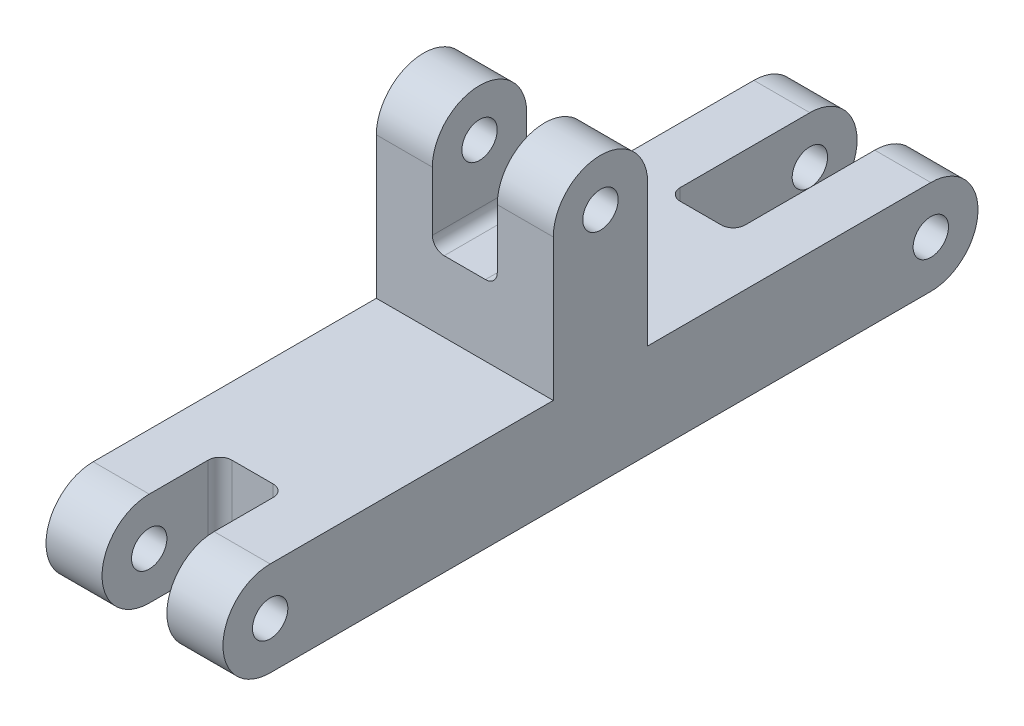
ISO-10303-21;
HEADER;
FILE_DESCRIPTION(('STEP AP214'),'2;1');
FILE_NAME('part.step','',(''),(''),'','','');
FILE_SCHEMA(('AUTOMOTIVE_DESIGN { 1 0 10303 214 1 1 1 1 }'));
ENDSEC;
DATA;
#1=APPLICATION_CONTEXT('core data for automotive mechanical design processes');
#2=APPLICATION_PROTOCOL_DEFINITION('international standard','automotive_design',2000,#1);
#3=PRODUCT_CONTEXT('',#1,'mechanical');
#4=PRODUCT('Part','Part','',(#3));
#5=PRODUCT_RELATED_PRODUCT_CATEGORY('part','',(#4));
#6=PRODUCT_DEFINITION_FORMATION('','',#4);
#7=PRODUCT_DEFINITION_CONTEXT('part definition',#1,'design');
#8=PRODUCT_DEFINITION('design','',#6,#7);
#9=PRODUCT_DEFINITION_SHAPE('','',#8);
#10=(LENGTH_UNIT() NAMED_UNIT(*) SI_UNIT(.MILLI.,.METRE.));
#11=(NAMED_UNIT(*) PLANE_ANGLE_UNIT() SI_UNIT($,.RADIAN.));
#12=(NAMED_UNIT(*) SI_UNIT($,.STERADIAN.) SOLID_ANGLE_UNIT());
#13=UNCERTAINTY_MEASURE_WITH_UNIT(LENGTH_MEASURE(1.E-05),#10,'distance_accuracy_value','');
#14=(GEOMETRIC_REPRESENTATION_CONTEXT(3) GLOBAL_UNCERTAINTY_ASSIGNED_CONTEXT((#13)) GLOBAL_UNIT_ASSIGNED_CONTEXT((#10,
#11,#12)) REPRESENTATION_CONTEXT('',''));
#15=CARTESIAN_POINT('',(0.,0.,0.));
#16=DIRECTION('',(0.,0.,1.));
#17=DIRECTION('',(1.,0.,0.));
#18=AXIS2_PLACEMENT_3D('',#15,#16,#17);
#19=CARTESIAN_POINT('',(7.5,0.,41.));
#20=DIRECTION('',(-1.,0.,0.));
#21=DIRECTION('',(0.,0.,1.));
#22=AXIS2_PLACEMENT_3D('',#19,#20,#21);
#23=CYLINDRICAL_SURFACE('',#22,3.99999999999999);
#24=CARTESIAN_POINT('',(2.75,0.,41.));
#25=DIRECTION('',(-1.,0.,0.));
#26=DIRECTION('',(0.,0.,1.));
#27=AXIS2_PLACEMENT_3D('',#24,#25,#26);
#28=CIRCLE('',#27,3.99999999999999);
#29=CARTESIAN_POINT('',(2.75,-3.99999999999999,41.));
#30=VERTEX_POINT('',#29);
#31=CARTESIAN_POINT('',(2.75,3.99999999999999,41.));
#32=VERTEX_POINT('',#31);
#33=EDGE_CURVE('E222',#30,#32,#28,.T.);
#34=ORIENTED_EDGE('',*,*,#33,.F.);
#35=DIRECTION('',(-1.,0.,0.));
#36=VECTOR('',#35,1.);
#37=CARTESIAN_POINT('',(7.5,-3.99999999999999,41.));
#38=LINE('',#37,#36);
#39=CARTESIAN_POINT('',(7.5,-3.99999999999999,41.));
#40=VERTEX_POINT('',#39);
#41=EDGE_CURVE('E238',#40,#30,#38,.T.);
#42=ORIENTED_EDGE('',*,*,#41,.F.);
#43=CARTESIAN_POINT('',(7.5,0.,41.));
#44=DIRECTION('',(1.,0.,0.));
#45=DIRECTION('',(0.,0.,-1.));
#46=AXIS2_PLACEMENT_3D('',#43,#44,#45);
#47=CIRCLE('',#46,3.99999999999999);
#48=CARTESIAN_POINT('',(7.5,3.99999999999999,41.));
#49=VERTEX_POINT('',#48);
#50=EDGE_CURVE('E231',#49,#40,#47,.T.);
#51=ORIENTED_EDGE('',*,*,#50,.F.);
#52=DIRECTION('',(-1.,0.,0.));
#53=VECTOR('',#52,1.);
#54=CARTESIAN_POINT('',(7.5,3.99999999999999,41.));
#55=LINE('',#54,#53);
#56=EDGE_CURVE('E213',#49,#32,#55,.T.);
#57=ORIENTED_EDGE('',*,*,#56,.T.);
#58=EDGE_LOOP('',(#34,#42,#51,#57));
#59=FACE_BOUND('',#58,.T.);
#60=ADVANCED_FACE('F34',(#59),#23,.T.);
#61=CARTESIAN_POINT('',(7.5,-4.,15.));
#62=DIRECTION('',(0.,1.,0.));
#63=DIRECTION('',(0.,0.,1.));
#64=AXIS2_PLACEMENT_3D('',#61,#62,#63);
#65=PLANE('',#64);
#66=DIRECTION('',(1.,0.,0.));
#67=VECTOR('',#66,1.);
#68=CARTESIAN_POINT('',(-2.75,-3.99999999999999,35.));
#69=LINE('',#68,#67);
#70=CARTESIAN_POINT('',(-1.75,-3.99999999999999,35.));
#71=VERTEX_POINT('',#70);
#72=CARTESIAN_POINT('',(1.75,-3.99999999999999,35.));
#73=VERTEX_POINT('',#72);
#74=EDGE_CURVE('E316',#71,#73,#69,.T.);
#75=ORIENTED_EDGE('',*,*,#74,.F.);
#76=CARTESIAN_POINT('',(-1.75,-4.,36.));
#77=DIRECTION('',(0.,1.,0.));
#78=DIRECTION('',(0.,0.,1.));
#79=AXIS2_PLACEMENT_3D('',#76,#77,#78);
#80=CIRCLE('',#79,1.);
#81=CARTESIAN_POINT('',(-2.75,-3.99999999999999,36.));
#82=VERTEX_POINT('',#81);
#83=EDGE_CURVE('E11',#71,#82,#80,.T.);
#84=ORIENTED_EDGE('',*,*,#83,.T.);
#85=DIRECTION('',(0.,0.,-1.));
#86=VECTOR('',#85,1.);
#87=CARTESIAN_POINT('',(-2.75,-3.99999999999999,35.));
#88=LINE('',#87,#86);
#89=CARTESIAN_POINT('',(-2.75,-3.99999999999999,41.));
#90=VERTEX_POINT('',#89);
#91=EDGE_CURVE('E317',#90,#82,#88,.T.);
#92=ORIENTED_EDGE('',*,*,#91,.F.);
#93=CARTESIAN_POINT('',(-7.5,-3.99999999999999,41.));
#94=VERTEX_POINT('',#93);
#95=EDGE_CURVE('E427',#90,#94,#38,.T.);
#96=ORIENTED_EDGE('',*,*,#95,.T.);
#97=DIRECTION('',(0.,0.,-1.));
#98=VECTOR('',#97,1.);
#99=CARTESIAN_POINT('',(-7.5,-4.,15.));
#100=LINE('',#99,#98);
#101=CARTESIAN_POINT('',(-7.5,-4.,-15.));
#102=VERTEX_POINT('',#101);
#103=EDGE_CURVE('E393',#94,#102,#100,.T.);
#104=ORIENTED_EDGE('',*,*,#103,.T.);
#105=DIRECTION('',(-1.,0.,0.));
#106=VECTOR('',#105,1.);
#107=CARTESIAN_POINT('',(7.5,-4.,-15.));
#108=LINE('',#107,#106);
#109=CARTESIAN_POINT('',(-2.75,-3.99999999999999,-15.));
#110=VERTEX_POINT('',#109);
#111=EDGE_CURVE('E424',#110,#102,#108,.T.);
#112=ORIENTED_EDGE('',*,*,#111,.F.);
#113=DIRECTION('',(0.,0.,-1.));
#114=VECTOR('',#113,1.);
#115=CARTESIAN_POINT('',(-2.75,-3.99999999999999,-3.));
#116=LINE('',#115,#114);
#117=CARTESIAN_POINT('',(-2.75,-3.99999999999999,-4.));
#118=VERTEX_POINT('',#117);
#119=EDGE_CURVE('E330',#118,#110,#116,.T.);
#120=ORIENTED_EDGE('',*,*,#119,.F.);
#121=CARTESIAN_POINT('',(-1.75,-4.,-4.));
#122=DIRECTION('',(0.,1.,0.));
#123=DIRECTION('',(0.,0.,1.));
#124=AXIS2_PLACEMENT_3D('',#121,#122,#123);
#125=CIRCLE('',#124,1.);
#126=CARTESIAN_POINT('',(-1.75,-3.99999999999999,-3.));
#127=VERTEX_POINT('',#126);
#128=EDGE_CURVE('E302',#118,#127,#125,.T.);
#129=ORIENTED_EDGE('',*,*,#128,.T.);
#130=DIRECTION('',(1.,0.,0.));
#131=VECTOR('',#130,1.);
#132=CARTESIAN_POINT('',(-2.75,-3.99999999999999,-3.));
#133=LINE('',#132,#131);
#134=CARTESIAN_POINT('',(1.75,-3.99999999999999,-3.));
#135=VERTEX_POINT('',#134);
#136=EDGE_CURVE('E336',#127,#135,#133,.T.);
#137=ORIENTED_EDGE('',*,*,#136,.T.);
#138=CARTESIAN_POINT('',(1.75,-4.,-4.));
#139=DIRECTION('',(0.,1.,0.));
#140=DIRECTION('',(0.,0.,1.));
#141=AXIS2_PLACEMENT_3D('',#138,#139,#140);
#142=CIRCLE('',#141,1.);
#143=CARTESIAN_POINT('',(2.75,-3.99999999999999,-4.));
#144=VERTEX_POINT('',#143);
#145=EDGE_CURVE('E298',#135,#144,#142,.T.);
#146=ORIENTED_EDGE('',*,*,#145,.T.);
#147=DIRECTION('',(0.,0.,-1.));
#148=VECTOR('',#147,1.);
#149=CARTESIAN_POINT('',(2.75,-3.99999999999999,-3.));
#150=LINE('',#149,#148);
#151=CARTESIAN_POINT('',(2.75,-3.99999999999999,-15.));
#152=VERTEX_POINT('',#151);
#153=EDGE_CURVE('E337',#144,#152,#150,.T.);
#154=ORIENTED_EDGE('',*,*,#153,.T.);
#155=CARTESIAN_POINT('',(7.5,-4.,-15.));
#156=VERTEX_POINT('',#155);
#157=EDGE_CURVE('E425',#156,#152,#108,.T.);
#158=ORIENTED_EDGE('',*,*,#157,.F.);
#159=DIRECTION('',(0.,0.,-1.));
#160=VECTOR('',#159,1.);
#161=CARTESIAN_POINT('',(7.5,-4.,15.));
#162=LINE('',#161,#160);
#163=EDGE_CURVE('E375',#40,#156,#162,.T.);
#164=ORIENTED_EDGE('',*,*,#163,.F.);
#165=ORIENTED_EDGE('',*,*,#41,.T.);
#166=DIRECTION('',(0.,0.,-1.));
#167=VECTOR('',#166,1.);
#168=CARTESIAN_POINT('',(2.75,-3.99999999999999,35.));
#169=LINE('',#168,#167);
#170=CARTESIAN_POINT('',(2.75,-3.99999999999999,36.));
#171=VERTEX_POINT('',#170);
#172=EDGE_CURVE('E218',#30,#171,#169,.T.);
#173=ORIENTED_EDGE('',*,*,#172,.T.);
#174=CARTESIAN_POINT('',(1.75,-4.,36.));
#175=DIRECTION('',(0.,1.,0.));
#176=DIRECTION('',(0.,0.,1.));
#177=AXIS2_PLACEMENT_3D('',#174,#175,#176);
#178=CIRCLE('',#177,1.);
#179=EDGE_CURVE('E307',#171,#73,#178,.T.);
#180=ORIENTED_EDGE('',*,*,#179,.T.);
#181=EDGE_LOOP('',(#75,#84,#92,#96,#104,#112,#120,#129,#137,#146,#154,#158,#164,#165,#173,#180));
#182=FACE_BOUND('',#181,.T.);
#183=ADVANCED_FACE('F440',(#182),#65,.F.);
#184=CARTESIAN_POINT('',(7.5,0.,-15.));
#185=DIRECTION('',(-1.,0.,0.));
#186=DIRECTION('',(0.,0.,1.));
#187=AXIS2_PLACEMENT_3D('',#184,#185,#186);
#188=CYLINDRICAL_SURFACE('',#187,4.);
#189=CARTESIAN_POINT('',(-2.75,0.,-15.));
#190=DIRECTION('',(1.,0.,0.));
#191=DIRECTION('',(0.,0.,-1.));
#192=AXIS2_PLACEMENT_3D('',#189,#190,#191);
#193=CIRCLE('',#192,4.);
#194=CARTESIAN_POINT('',(-2.75,4.,-15.));
#195=VERTEX_POINT('',#194);
#196=EDGE_CURVE('E262',#110,#195,#193,.T.);
#197=ORIENTED_EDGE('',*,*,#196,.F.);
#198=ORIENTED_EDGE('',*,*,#111,.T.);
#199=CARTESIAN_POINT('',(-7.5,0.,-15.));
#200=DIRECTION('',(1.,0.,0.));
#201=DIRECTION('',(0.,0.,-1.));
#202=AXIS2_PLACEMENT_3D('',#199,#200,#201);
#203=CIRCLE('',#202,4.);
#204=CARTESIAN_POINT('',(-7.5,4.,-15.));
#205=VERTEX_POINT('',#204);
#206=EDGE_CURVE('E396',#102,#205,#203,.T.);
#207=ORIENTED_EDGE('',*,*,#206,.T.);
#208=DIRECTION('',(-1.,0.,0.));
#209=VECTOR('',#208,1.);
#210=CARTESIAN_POINT('',(7.5,4.,-15.));
#211=LINE('',#210,#209);
#212=EDGE_CURVE('E421',#195,#205,#211,.T.);
#213=ORIENTED_EDGE('',*,*,#212,.F.);
#214=EDGE_LOOP('',(#197,#198,#207,#213));
#215=FACE_BOUND('',#214,.T.);
#216=ADVANCED_FACE('F434',(#215),#188,.T.);
#217=CARTESIAN_POINT('',(7.5,3.99999999999999,9.00000000000001));
#218=DIRECTION('',(0.,-1.,0.));
#219=DIRECTION('',(0.,0.,-1.));
#220=AXIS2_PLACEMENT_3D('',#217,#218,#219);
#221=PLANE('',#220);
#222=DIRECTION('',(0.,0.,1.));
#223=VECTOR('',#222,1.);
#224=CARTESIAN_POINT('',(-2.75,4.,-3.));
#225=LINE('',#224,#223);
#226=CARTESIAN_POINT('',(-2.75,4.,-4.));
#227=VERTEX_POINT('',#226);
#228=EDGE_CURVE('E332',#195,#227,#225,.T.);
#229=ORIENTED_EDGE('',*,*,#228,.F.);
#230=ORIENTED_EDGE('',*,*,#212,.T.);
#231=DIRECTION('',(0.,0.,1.));
#232=VECTOR('',#231,1.);
#233=CARTESIAN_POINT('',(-7.5,3.99999999999999,9.00000000000001));
#234=LINE('',#233,#232);
#235=CARTESIAN_POINT('',(-7.5,3.99999999999999,9.00000000000001));
#236=VERTEX_POINT('',#235);
#237=EDGE_CURVE('E399',#205,#236,#234,.T.);
#238=ORIENTED_EDGE('',*,*,#237,.T.);
#239=DIRECTION('',(-1.,0.,0.));
#240=VECTOR('',#239,1.);
#241=CARTESIAN_POINT('',(7.5,3.99999999999999,9.00000000000001));
#242=LINE('',#241,#240);
#243=CARTESIAN_POINT('',(7.5,3.99999999999999,9.00000000000001));
#244=VERTEX_POINT('',#243);
#245=EDGE_CURVE('E418',#244,#236,#242,.T.);
#246=ORIENTED_EDGE('',*,*,#245,.F.);
#247=DIRECTION('',(0.,0.,1.));
#248=VECTOR('',#247,1.);
#249=CARTESIAN_POINT('',(7.5,3.99999999999999,9.00000000000001));
#250=LINE('',#249,#248);
#251=CARTESIAN_POINT('',(7.5,4.,-15.));
#252=VERTEX_POINT('',#251);
#253=EDGE_CURVE('E379',#252,#244,#250,.T.);
#254=ORIENTED_EDGE('',*,*,#253,.F.);
#255=CARTESIAN_POINT('',(2.75,4.,-15.));
#256=VERTEX_POINT('',#255);
#257=EDGE_CURVE('E422',#252,#256,#211,.T.);
#258=ORIENTED_EDGE('',*,*,#257,.T.);
#259=DIRECTION('',(0.,0.,1.));
#260=VECTOR('',#259,1.);
#261=CARTESIAN_POINT('',(2.75,4.,-3.));
#262=LINE('',#261,#260);
#263=CARTESIAN_POINT('',(2.75,4.,-4.));
#264=VERTEX_POINT('',#263);
#265=EDGE_CURVE('E333',#256,#264,#262,.T.);
#266=ORIENTED_EDGE('',*,*,#265,.T.);
#267=CARTESIAN_POINT('',(1.75,4.,-4.));
#268=DIRECTION('',(0.,-1.,0.));
#269=DIRECTION('',(0.,0.,-1.));
#270=AXIS2_PLACEMENT_3D('',#267,#268,#269);
#271=CIRCLE('',#270,1.);
#272=CARTESIAN_POINT('',(1.75,4.,-3.));
#273=VERTEX_POINT('',#272);
#274=EDGE_CURVE('E300',#264,#273,#271,.T.);
#275=ORIENTED_EDGE('',*,*,#274,.T.);
#276=DIRECTION('',(1.,0.,0.));
#277=VECTOR('',#276,1.);
#278=CARTESIAN_POINT('',(-2.75,4.,-3.));
#279=LINE('',#278,#277);
#280=CARTESIAN_POINT('',(-1.75,4.,-3.));
#281=VERTEX_POINT('',#280);
#282=EDGE_CURVE('E219',#281,#273,#279,.T.);
#283=ORIENTED_EDGE('',*,*,#282,.F.);
#284=CARTESIAN_POINT('',(-1.75,4.,-4.));
#285=DIRECTION('',(0.,-1.,0.));
#286=DIRECTION('',(0.,0.,-1.));
#287=AXIS2_PLACEMENT_3D('',#284,#285,#286);
#288=CIRCLE('',#287,1.);
#289=EDGE_CURVE('E304',#281,#227,#288,.T.);
#290=ORIENTED_EDGE('',*,*,#289,.T.);
#291=EDGE_LOOP('',(#229,#230,#238,#246,#254,#258,#266,#275,#283,#290));
#292=FACE_BOUND('',#291,.T.);
#293=ADVANCED_FACE('F451',(#292),#221,.F.);
#294=CARTESIAN_POINT('',(7.5,16.,13.));
#295=DIRECTION('',(-1.,0.,0.));
#296=DIRECTION('',(0.,0.,1.));
#297=AXIS2_PLACEMENT_3D('',#294,#295,#296);
#298=CYLINDRICAL_SURFACE('',#297,4.);
#299=CARTESIAN_POINT('',(2.75,16.,13.));
#300=DIRECTION('',(-1.,0.,0.));
#301=DIRECTION('',(0.,0.,1.));
#302=AXIS2_PLACEMENT_3D('',#299,#300,#301);
#303=CIRCLE('',#302,4.);
#304=CARTESIAN_POINT('',(2.75,16.,17.));
#305=VERTEX_POINT('',#304);
#306=CARTESIAN_POINT('',(2.75,16.,9.00000000000001));
#307=VERTEX_POINT('',#306);
#308=EDGE_CURVE('E251',#305,#307,#303,.T.);
#309=ORIENTED_EDGE('',*,*,#308,.F.);
#310=DIRECTION('',(-1.,0.,0.));
#311=VECTOR('',#310,1.);
#312=CARTESIAN_POINT('',(7.5,16.,17.));
#313=LINE('',#312,#311);
#314=CARTESIAN_POINT('',(7.5,16.,17.));
#315=VERTEX_POINT('',#314);
#316=EDGE_CURVE('E411',#315,#305,#313,.T.);
#317=ORIENTED_EDGE('',*,*,#316,.F.);
#318=CARTESIAN_POINT('',(7.5,16.,13.));
#319=DIRECTION('',(1.,0.,0.));
#320=DIRECTION('',(0.,0.,-1.));
#321=AXIS2_PLACEMENT_3D('',#318,#319,#320);
#322=CIRCLE('',#321,4.);
#323=CARTESIAN_POINT('',(7.5,16.,9.00000000000001));
#324=VERTEX_POINT('',#323);
#325=EDGE_CURVE('E383',#324,#315,#322,.T.);
#326=ORIENTED_EDGE('',*,*,#325,.F.);
#327=DIRECTION('',(-1.,0.,0.));
#328=VECTOR('',#327,1.);
#329=CARTESIAN_POINT('',(7.5,16.,9.00000000000001));
#330=LINE('',#329,#328);
#331=EDGE_CURVE('E415',#324,#307,#330,.T.);
#332=ORIENTED_EDGE('',*,*,#331,.T.);
#333=EDGE_LOOP('',(#309,#317,#326,#332));
#334=FACE_BOUND('',#333,.T.);
#335=ADVANCED_FACE('F512',(#334),#298,.T.);
#336=CARTESIAN_POINT('',(7.5,0.,-15.));
#337=DIRECTION('',(-1.,0.,0.));
#338=DIRECTION('',(0.,0.,1.));
#339=AXIS2_PLACEMENT_3D('',#336,#337,#338);
#340=CYLINDRICAL_SURFACE('',#339,1.5);
#341=CARTESIAN_POINT('',(-7.5,0.,-15.));
#342=DIRECTION('',(1.,0.,0.));
#343=DIRECTION('',(0.,0.,-1.));
#344=AXIS2_PLACEMENT_3D('',#341,#342,#343);
#345=CIRCLE('',#344,1.5);
#346=CARTESIAN_POINT('',(-7.5,0.,-16.5));
#347=VERTEX_POINT('',#346);
#348=EDGE_CURVE('E362',#347,#347,#345,.T.);
#349=ORIENTED_EDGE('',*,*,#348,.F.);
#350=EDGE_LOOP('',(#349));
#351=FACE_BOUND('',#350,.T.);
#352=CARTESIAN_POINT('',(-2.75,0.,-15.));
#353=DIRECTION('',(1.,0.,0.));
#354=DIRECTION('',(0.,0.,-1.));
#355=AXIS2_PLACEMENT_3D('',#352,#353,#354);
#356=CIRCLE('',#355,1.5);
#357=CARTESIAN_POINT('',(-2.75,0.,-16.5));
#358=VERTEX_POINT('',#357);
#359=EDGE_CURVE('E260',#358,#358,#356,.T.);
#360=ORIENTED_EDGE('',*,*,#359,.T.);
#361=EDGE_LOOP('',(#360));
#362=FACE_BOUND('',#361,.T.);
#363=ADVANCED_FACE('F533',(#351,#362),#340,.F.);
#364=CARTESIAN_POINT('',(7.5,16.,13.));
#365=DIRECTION('',(-1.,0.,0.));
#366=DIRECTION('',(0.,0.,1.));
#367=AXIS2_PLACEMENT_3D('',#364,#365,#366);
#368=CYLINDRICAL_SURFACE('',#367,1.49999999999999);
#369=CARTESIAN_POINT('',(7.5,16.,13.));
#370=DIRECTION('',(1.,0.,0.));
#371=DIRECTION('',(0.,0.,-1.));
#372=AXIS2_PLACEMENT_3D('',#369,#370,#371);
#373=CIRCLE('',#372,1.49999999999999);
#374=CARTESIAN_POINT('',(7.5,16.,11.5));
#375=VERTEX_POINT('',#374);
#376=EDGE_CURVE('E359',#375,#375,#373,.T.);
#377=ORIENTED_EDGE('',*,*,#376,.T.);
#378=EDGE_LOOP('',(#377));
#379=FACE_BOUND('',#378,.T.);
#380=CARTESIAN_POINT('',(2.75,16.,13.));
#381=DIRECTION('',(-1.,0.,0.));
#382=DIRECTION('',(0.,0.,1.));
#383=AXIS2_PLACEMENT_3D('',#380,#381,#382);
#384=CIRCLE('',#383,1.49999999999999);
#385=CARTESIAN_POINT('',(2.75,16.,14.5));
#386=VERTEX_POINT('',#385);
#387=EDGE_CURVE('E248',#386,#386,#384,.T.);
#388=ORIENTED_EDGE('',*,*,#387,.T.);
#389=EDGE_LOOP('',(#388));
#390=FACE_BOUND('',#389,.T.);
#391=ADVANCED_FACE('F538',(#379,#390),#368,.F.);
#392=CARTESIAN_POINT('',(7.5,0.,41.));
#393=DIRECTION('',(-1.,0.,0.));
#394=DIRECTION('',(0.,0.,1.));
#395=AXIS2_PLACEMENT_3D('',#392,#393,#394);
#396=CYLINDRICAL_SURFACE('',#395,1.5);
#397=CARTESIAN_POINT('',(7.5,0.,41.));
#398=DIRECTION('',(1.,0.,0.));
#399=DIRECTION('',(0.,0.,-1.));
#400=AXIS2_PLACEMENT_3D('',#397,#398,#399);
#401=CIRCLE('',#400,1.5);
#402=CARTESIAN_POINT('',(7.5,0.,39.5));
#403=VERTEX_POINT('',#402);
#404=EDGE_CURVE('E353',#403,#403,#401,.T.);
#405=ORIENTED_EDGE('',*,*,#404,.T.);
#406=EDGE_LOOP('',(#405));
#407=FACE_BOUND('',#406,.T.);
#408=CARTESIAN_POINT('',(2.75,0.,41.));
#409=DIRECTION('',(-1.,0.,0.));
#410=DIRECTION('',(0.,0.,1.));
#411=AXIS2_PLACEMENT_3D('',#408,#409,#410);
#412=CIRCLE('',#411,1.5);
#413=CARTESIAN_POINT('',(2.75,0.,42.5));
#414=VERTEX_POINT('',#413);
#415=EDGE_CURVE('E229',#414,#414,#412,.T.);
#416=ORIENTED_EDGE('',*,*,#415,.T.);
#417=EDGE_LOOP('',(#416));
#418=FACE_BOUND('',#417,.T.);
#419=ADVANCED_FACE('F527',(#407,#418),#396,.F.);
#420=CARTESIAN_POINT('',(7.5,0.,41.));
#421=DIRECTION('',(1.,0.,0.));
#422=DIRECTION('',(0.,0.,-1.));
#423=AXIS2_PLACEMENT_3D('',#420,#421,#422);
#424=PLANE('',#423);
#425=ORIENTED_EDGE('',*,*,#376,.F.);
#426=EDGE_LOOP('',(#425));
#427=FACE_BOUND('',#426,.T.);
#428=DIRECTION('',(0.,0.,1.));
#429=VECTOR('',#428,1.);
#430=CARTESIAN_POINT('',(7.5,3.99999999999999,17.));
#431=LINE('',#430,#429);
#432=CARTESIAN_POINT('',(7.5,3.99999999999999,17.));
#433=VERTEX_POINT('',#432);
#434=EDGE_CURVE('E371',#433,#49,#431,.T.);
#435=ORIENTED_EDGE('',*,*,#434,.T.);
#436=ORIENTED_EDGE('',*,*,#50,.T.);
#437=ORIENTED_EDGE('',*,*,#163,.T.);
#438=CARTESIAN_POINT('',(7.5,0.,-15.));
#439=DIRECTION('',(1.,0.,0.));
#440=DIRECTION('',(0.,0.,-1.));
#441=AXIS2_PLACEMENT_3D('',#438,#439,#440);
#442=CIRCLE('',#441,4.);
#443=EDGE_CURVE('E377',#156,#252,#442,.T.);
#444=ORIENTED_EDGE('',*,*,#443,.T.);
#445=ORIENTED_EDGE('',*,*,#253,.T.);
#446=DIRECTION('',(0.,1.,0.));
#447=VECTOR('',#446,1.);
#448=CARTESIAN_POINT('',(7.5,3.99999999999999,9.00000000000001));
#449=LINE('',#448,#447);
#450=EDGE_CURVE('E381',#244,#324,#449,.T.);
#451=ORIENTED_EDGE('',*,*,#450,.T.);
#452=ORIENTED_EDGE('',*,*,#325,.T.);
#453=DIRECTION('',(0.,-1.,0.));
#454=VECTOR('',#453,1.);
#455=CARTESIAN_POINT('',(7.5,3.99999999999999,17.));
#456=LINE('',#455,#454);
#457=EDGE_CURVE('E385',#315,#433,#456,.T.);
#458=ORIENTED_EDGE('',*,*,#457,.T.);
#459=EDGE_LOOP('',(#435,#436,#437,#444,#445,#451,#452,#458));
#460=FACE_BOUND('',#459,.T.);
#461=CARTESIAN_POINT('',(7.5,0.,-15.));
#462=DIRECTION('',(1.,0.,0.));
#463=DIRECTION('',(0.,0.,-1.));
#464=AXIS2_PLACEMENT_3D('',#461,#462,#463);
#465=CIRCLE('',#464,1.5);
#466=CARTESIAN_POINT('',(7.5,0.,-16.5));
#467=VERTEX_POINT('',#466);
#468=EDGE_CURVE('E365',#467,#467,#465,.T.);
#469=ORIENTED_EDGE('',*,*,#468,.F.);
#470=EDGE_LOOP('',(#469));
#471=FACE_BOUND('',#470,.T.);
#472=ORIENTED_EDGE('',*,*,#404,.F.);
#473=EDGE_LOOP('',(#472));
#474=FACE_BOUND('',#473,.T.);
#475=ADVANCED_FACE('F460',(#427,#460,#471,#474),#424,.T.);
#476=CARTESIAN_POINT('',(-7.5,0.,41.));
#477=DIRECTION('',(1.,0.,0.));
#478=DIRECTION('',(0.,0.,-1.));
#479=AXIS2_PLACEMENT_3D('',#476,#477,#478);
#480=PLANE('',#479);
#481=DIRECTION('',(0.,0.,1.));
#482=VECTOR('',#481,1.);
#483=CARTESIAN_POINT('',(-7.5,3.99999999999999,17.));
#484=LINE('',#483,#482);
#485=CARTESIAN_POINT('',(-7.5,3.99999999999999,17.));
#486=VERTEX_POINT('',#485);
#487=CARTESIAN_POINT('',(-7.5,3.99999999999999,41.));
#488=VERTEX_POINT('',#487);
#489=EDGE_CURVE('E368',#486,#488,#484,.T.);
#490=ORIENTED_EDGE('',*,*,#489,.F.);
#491=DIRECTION('',(0.,-1.,0.));
#492=VECTOR('',#491,1.);
#493=CARTESIAN_POINT('',(-7.5,3.99999999999999,17.));
#494=LINE('',#493,#492);
#495=CARTESIAN_POINT('',(-7.5,16.,17.));
#496=VERTEX_POINT('',#495);
#497=EDGE_CURVE('E373',#496,#486,#494,.T.);
#498=ORIENTED_EDGE('',*,*,#497,.F.);
#499=CARTESIAN_POINT('',(-7.5,16.,13.));
#500=DIRECTION('',(1.,0.,0.));
#501=DIRECTION('',(0.,0.,-1.));
#502=AXIS2_PLACEMENT_3D('',#499,#500,#501);
#503=CIRCLE('',#502,4.);
#504=CARTESIAN_POINT('',(-7.5,16.,9.00000000000001));
#505=VERTEX_POINT('',#504);
#506=EDGE_CURVE('E404',#505,#496,#503,.T.);
#507=ORIENTED_EDGE('',*,*,#506,.F.);
#508=DIRECTION('',(0.,1.,0.));
#509=VECTOR('',#508,1.);
#510=CARTESIAN_POINT('',(-7.5,3.99999999999999,9.00000000000001));
#511=LINE('',#510,#509);
#512=EDGE_CURVE('E401',#236,#505,#511,.T.);
#513=ORIENTED_EDGE('',*,*,#512,.F.);
#514=ORIENTED_EDGE('',*,*,#237,.F.);
#515=ORIENTED_EDGE('',*,*,#206,.F.);
#516=ORIENTED_EDGE('',*,*,#103,.F.);
#517=CARTESIAN_POINT('',(-7.5,0.,41.));
#518=DIRECTION('',(1.,0.,0.));
#519=DIRECTION('',(0.,0.,-1.));
#520=AXIS2_PLACEMENT_3D('',#517,#518,#519);
#521=CIRCLE('',#520,3.99999999999999);
#522=EDGE_CURVE('E390',#488,#94,#521,.T.);
#523=ORIENTED_EDGE('',*,*,#522,.F.);
#524=EDGE_LOOP('',(#490,#498,#507,#513,#514,#515,#516,#523));
#525=FACE_BOUND('',#524,.T.);
#526=ORIENTED_EDGE('',*,*,#348,.T.);
#527=EDGE_LOOP('',(#526));
#528=FACE_BOUND('',#527,.T.);
#529=CARTESIAN_POINT('',(-7.5,16.,13.));
#530=DIRECTION('',(1.,0.,0.));
#531=DIRECTION('',(0.,0.,-1.));
#532=AXIS2_PLACEMENT_3D('',#529,#530,#531);
#533=CIRCLE('',#532,1.49999999999999);
#534=CARTESIAN_POINT('',(-7.5,16.,11.5));
#535=VERTEX_POINT('',#534);
#536=EDGE_CURVE('E356',#535,#535,#533,.T.);
#537=ORIENTED_EDGE('',*,*,#536,.T.);
#538=EDGE_LOOP('',(#537));
#539=FACE_BOUND('',#538,.T.);
#540=CARTESIAN_POINT('',(-7.5,0.,41.));
#541=DIRECTION('',(1.,0.,0.));
#542=DIRECTION('',(0.,0.,-1.));
#543=AXIS2_PLACEMENT_3D('',#540,#541,#542);
#544=CIRCLE('',#543,1.5);
#545=CARTESIAN_POINT('',(-7.5,0.,39.5));
#546=VERTEX_POINT('',#545);
#547=EDGE_CURVE('E352',#546,#546,#544,.T.);
#548=ORIENTED_EDGE('',*,*,#547,.T.);
#549=EDGE_LOOP('',(#548));
#550=FACE_BOUND('',#549,.T.);
#551=ADVANCED_FACE('F444',(#525,#528,#539,#550),#480,.F.);
#552=CARTESIAN_POINT('',(7.5,3.99999999999999,17.));
#553=DIRECTION('',(0.,-1.,0.));
#554=DIRECTION('',(0.,0.,-1.));
#555=AXIS2_PLACEMENT_3D('',#552,#553,#554);
#556=PLANE('',#555);
#557=CARTESIAN_POINT('',(-2.75,3.99999999999999,41.));
#558=VERTEX_POINT('',#557);
#559=EDGE_CURVE('E234',#558,#488,#55,.T.);
#560=ORIENTED_EDGE('',*,*,#559,.F.);
#561=DIRECTION('',(0.,0.,1.));
#562=VECTOR('',#561,1.);
#563=CARTESIAN_POINT('',(-2.75,3.99999999999999,35.));
#564=LINE('',#563,#562);
#565=CARTESIAN_POINT('',(-2.75,3.99999999999999,36.));
#566=VERTEX_POINT('',#565);
#567=EDGE_CURVE('E311',#566,#558,#564,.T.);
#568=ORIENTED_EDGE('',*,*,#567,.F.);
#569=CARTESIAN_POINT('',(-1.75,3.99999999999999,36.));
#570=DIRECTION('',(0.,-1.,0.));
#571=DIRECTION('',(0.,0.,-1.));
#572=AXIS2_PLACEMENT_3D('',#569,#570,#571);
#573=CIRCLE('',#572,1.);
#574=CARTESIAN_POINT('',(-1.75,3.99999999999999,35.));
#575=VERTEX_POINT('',#574);
#576=EDGE_CURVE('E42',#566,#575,#573,.T.);
#577=ORIENTED_EDGE('',*,*,#576,.T.);
#578=DIRECTION('',(1.,0.,0.));
#579=VECTOR('',#578,1.);
#580=CARTESIAN_POINT('',(-2.75,3.99999999999999,35.));
#581=LINE('',#580,#579);
#582=CARTESIAN_POINT('',(1.75,3.99999999999999,35.));
#583=VERTEX_POINT('',#582);
#584=EDGE_CURVE('E310',#575,#583,#581,.T.);
#585=ORIENTED_EDGE('',*,*,#584,.T.);
#586=CARTESIAN_POINT('',(1.75,3.99999999999999,36.));
#587=DIRECTION('',(0.,-1.,0.));
#588=DIRECTION('',(0.,0.,-1.));
#589=AXIS2_PLACEMENT_3D('',#586,#587,#588);
#590=CIRCLE('',#589,1.);
#591=CARTESIAN_POINT('',(2.75,3.99999999999999,36.));
#592=VERTEX_POINT('',#591);
#593=EDGE_CURVE('E215',#583,#592,#590,.T.);
#594=ORIENTED_EDGE('',*,*,#593,.T.);
#595=DIRECTION('',(0.,0.,1.));
#596=VECTOR('',#595,1.);
#597=CARTESIAN_POINT('',(2.75,3.99999999999999,35.));
#598=LINE('',#597,#596);
#599=EDGE_CURVE('E207',#592,#32,#598,.T.);
#600=ORIENTED_EDGE('',*,*,#599,.T.);
#601=ORIENTED_EDGE('',*,*,#56,.F.);
#602=ORIENTED_EDGE('',*,*,#434,.F.);
#603=DIRECTION('',(-1.,0.,0.));
#604=VECTOR('',#603,1.);
#605=CARTESIAN_POINT('',(7.5,3.99999999999999,17.));
#606=LINE('',#605,#604);
#607=EDGE_CURVE('E387',#433,#486,#606,.T.);
#608=ORIENTED_EDGE('',*,*,#607,.T.);
#609=ORIENTED_EDGE('',*,*,#489,.T.);
#610=EDGE_LOOP('',(#560,#568,#577,#585,#594,#600,#601,#602,#608,#609));
#611=FACE_BOUND('',#610,.T.);
#612=ADVANCED_FACE('F210',(#611),#556,.F.);
#613=CARTESIAN_POINT('',(-2.75,0.,41.));
#614=DIRECTION('',(-1.,0.,0.));
#615=DIRECTION('',(0.,0.,1.));
#616=AXIS2_PLACEMENT_3D('',#613,#614,#615);
#617=CIRCLE('',#616,3.99999999999999);
#618=EDGE_CURVE('E247',#90,#558,#617,.T.);
#619=ORIENTED_EDGE('',*,*,#618,.T.);
#620=ORIENTED_EDGE('',*,*,#559,.T.);
#621=ORIENTED_EDGE('',*,*,#522,.T.);
#622=ORIENTED_EDGE('',*,*,#95,.F.);
#623=EDGE_LOOP('',(#619,#620,#621,#622));
#624=FACE_BOUND('',#623,.T.);
#625=ADVANCED_FACE('F492',(#624),#23,.T.);
#626=CARTESIAN_POINT('',(2.75,0.,-15.));
#627=DIRECTION('',(1.,0.,0.));
#628=DIRECTION('',(0.,0.,-1.));
#629=AXIS2_PLACEMENT_3D('',#626,#627,#628);
#630=CIRCLE('',#629,4.);
#631=EDGE_CURVE('E259',#152,#256,#630,.T.);
#632=ORIENTED_EDGE('',*,*,#631,.T.);
#633=ORIENTED_EDGE('',*,*,#257,.F.);
#634=ORIENTED_EDGE('',*,*,#443,.F.);
#635=ORIENTED_EDGE('',*,*,#157,.T.);
#636=EDGE_LOOP('',(#632,#633,#634,#635));
#637=FACE_BOUND('',#636,.T.);
#638=ADVANCED_FACE('F466',(#637),#188,.T.);
#639=CARTESIAN_POINT('',(7.5,3.99999999999999,9.00000000000001));
#640=DIRECTION('',(0.,0.,1.));
#641=DIRECTION('',(0.,-1.,0.));
#642=AXIS2_PLACEMENT_3D('',#639,#640,#641);
#643=PLANE('',#642);
#644=CARTESIAN_POINT('',(-2.75,16.,9.00000000000001));
#645=VERTEX_POINT('',#644);
#646=EDGE_CURVE('E414',#645,#505,#330,.T.);
#647=ORIENTED_EDGE('',*,*,#646,.F.);
#648=DIRECTION('',(0.,1.,0.));
#649=VECTOR('',#648,1.);
#650=CARTESIAN_POINT('',(-2.75,10.,9.00000000000001));
#651=LINE('',#650,#649);
#652=CARTESIAN_POINT('',(-2.75,11.,9.00000000000001));
#653=VERTEX_POINT('',#652);
#654=EDGE_CURVE('E580',#653,#645,#651,.T.);
#655=ORIENTED_EDGE('',*,*,#654,.F.);
#656=CARTESIAN_POINT('',(-1.75,11.,9.00000000000001));
#657=DIRECTION('',(0.,0.,1.));
#658=DIRECTION('',(0.,-1.,0.));
#659=AXIS2_PLACEMENT_3D('',#656,#657,#658);
#660=CIRCLE('',#659,1.);
#661=CARTESIAN_POINT('',(-1.75,10.,9.00000000000001));
#662=VERTEX_POINT('',#661);
#663=EDGE_CURVE('E294',#653,#662,#660,.T.);
#664=ORIENTED_EDGE('',*,*,#663,.T.);
#665=DIRECTION('',(1.,0.,0.));
#666=VECTOR('',#665,1.);
#667=CARTESIAN_POINT('',(-2.75,10.,9.00000000000001));
#668=LINE('',#667,#666);
#669=CARTESIAN_POINT('',(1.75,10.,9.00000000000001));
#670=VERTEX_POINT('',#669);
#671=EDGE_CURVE('E244',#662,#670,#668,.T.);
#672=ORIENTED_EDGE('',*,*,#671,.T.);
#673=CARTESIAN_POINT('',(1.75,11.,9.00000000000001));
#674=DIRECTION('',(0.,0.,1.));
#675=DIRECTION('',(0.,-1.,0.));
#676=AXIS2_PLACEMENT_3D('',#673,#674,#675);
#677=CIRCLE('',#676,1.);
#678=CARTESIAN_POINT('',(2.75,11.,9.00000000000001));
#679=VERTEX_POINT('',#678);
#680=EDGE_CURVE('E290',#670,#679,#677,.T.);
#681=ORIENTED_EDGE('',*,*,#680,.T.);
#682=DIRECTION('',(0.,1.,0.));
#683=VECTOR('',#682,1.);
#684=CARTESIAN_POINT('',(2.75,10.,9.00000000000001));
#685=LINE('',#684,#683);
#686=EDGE_CURVE('E581',#679,#307,#685,.T.);
#687=ORIENTED_EDGE('',*,*,#686,.T.);
#688=ORIENTED_EDGE('',*,*,#331,.F.);
#689=ORIENTED_EDGE('',*,*,#450,.F.);
#690=ORIENTED_EDGE('',*,*,#245,.T.);
#691=ORIENTED_EDGE('',*,*,#512,.T.);
#692=EDGE_LOOP('',(#647,#655,#664,#672,#681,#687,#688,#689,#690,#691));
#693=FACE_BOUND('',#692,.T.);
#694=ADVANCED_FACE('F456',(#693),#643,.F.);
#695=CARTESIAN_POINT('',(-2.75,16.,17.));
#696=VERTEX_POINT('',#695);
#697=EDGE_CURVE('E410',#696,#496,#313,.T.);
#698=ORIENTED_EDGE('',*,*,#697,.F.);
#699=CARTESIAN_POINT('',(-2.75,16.,13.));
#700=DIRECTION('',(-1.,0.,0.));
#701=DIRECTION('',(0.,0.,1.));
#702=AXIS2_PLACEMENT_3D('',#699,#700,#701);
#703=CIRCLE('',#702,4.);
#704=EDGE_CURVE('E255',#696,#645,#703,.T.);
#705=ORIENTED_EDGE('',*,*,#704,.T.);
#706=ORIENTED_EDGE('',*,*,#646,.T.);
#707=ORIENTED_EDGE('',*,*,#506,.T.);
#708=EDGE_LOOP('',(#698,#705,#706,#707));
#709=FACE_BOUND('',#708,.T.);
#710=ADVANCED_FACE('F515',(#709),#298,.T.);
#711=CARTESIAN_POINT('',(7.5,3.99999999999999,17.));
#712=DIRECTION('',(0.,0.,-1.));
#713=DIRECTION('',(-1.,0.,0.));
#714=AXIS2_PLACEMENT_3D('',#711,#712,#713);
#715=PLANE('',#714);
#716=DIRECTION('',(1.,0.,0.));
#717=VECTOR('',#716,1.);
#718=CARTESIAN_POINT('',(-2.75,10.,17.));
#719=LINE('',#718,#717);
#720=CARTESIAN_POINT('',(-1.75,10.,17.));
#721=VERTEX_POINT('',#720);
#722=CARTESIAN_POINT('',(1.75,10.,17.));
#723=VERTEX_POINT('',#722);
#724=EDGE_CURVE('E592',#721,#723,#719,.T.);
#725=ORIENTED_EDGE('',*,*,#724,.F.);
#726=CARTESIAN_POINT('',(-1.75,11.,17.));
#727=DIRECTION('',(0.,0.,-1.));
#728=DIRECTION('',(-1.,0.,0.));
#729=AXIS2_PLACEMENT_3D('',#726,#727,#728);
#730=CIRCLE('',#729,1.);
#731=CARTESIAN_POINT('',(-2.75,11.,17.));
#732=VERTEX_POINT('',#731);
#733=EDGE_CURVE('E296',#721,#732,#730,.T.);
#734=ORIENTED_EDGE('',*,*,#733,.T.);
#735=DIRECTION('',(0.,-1.,0.));
#736=VECTOR('',#735,1.);
#737=CARTESIAN_POINT('',(-2.75,10.,17.));
#738=LINE('',#737,#736);
#739=EDGE_CURVE('E576',#696,#732,#738,.T.);
#740=ORIENTED_EDGE('',*,*,#739,.F.);
#741=ORIENTED_EDGE('',*,*,#697,.T.);
#742=ORIENTED_EDGE('',*,*,#497,.T.);
#743=ORIENTED_EDGE('',*,*,#607,.F.);
#744=ORIENTED_EDGE('',*,*,#457,.F.);
#745=ORIENTED_EDGE('',*,*,#316,.T.);
#746=DIRECTION('',(0.,-1.,0.));
#747=VECTOR('',#746,1.);
#748=CARTESIAN_POINT('',(2.75,10.,17.));
#749=LINE('',#748,#747);
#750=CARTESIAN_POINT('',(2.75,11.,17.));
#751=VERTEX_POINT('',#750);
#752=EDGE_CURVE('E328',#305,#751,#749,.T.);
#753=ORIENTED_EDGE('',*,*,#752,.T.);
#754=CARTESIAN_POINT('',(1.75,11.,17.));
#755=DIRECTION('',(0.,0.,-1.));
#756=DIRECTION('',(-1.,0.,0.));
#757=AXIS2_PLACEMENT_3D('',#754,#755,#756);
#758=CIRCLE('',#757,1.);
#759=EDGE_CURVE('E292',#751,#723,#758,.T.);
#760=ORIENTED_EDGE('',*,*,#759,.T.);
#761=EDGE_LOOP('',(#725,#734,#740,#741,#742,#743,#744,#745,#753,#760));
#762=FACE_BOUND('',#761,.T.);
#763=ADVANCED_FACE('F518',(#762),#715,.F.);
#764=CARTESIAN_POINT('',(2.75,0.,-15.));
#765=DIRECTION('',(1.,0.,0.));
#766=DIRECTION('',(0.,0.,-1.));
#767=AXIS2_PLACEMENT_3D('',#764,#765,#766);
#768=CIRCLE('',#767,1.5);
#769=CARTESIAN_POINT('',(2.75,0.,-16.5));
#770=VERTEX_POINT('',#769);
#771=EDGE_CURVE('E256',#770,#770,#768,.T.);
#772=ORIENTED_EDGE('',*,*,#771,.F.);
#773=EDGE_LOOP('',(#772));
#774=FACE_BOUND('',#773,.T.);
#775=ORIENTED_EDGE('',*,*,#468,.T.);
#776=EDGE_LOOP('',(#775));
#777=FACE_BOUND('',#776,.T.);
#778=ADVANCED_FACE('F522',(#774,#777),#340,.F.);
#779=CARTESIAN_POINT('',(-2.75,16.,13.));
#780=DIRECTION('',(-1.,0.,0.));
#781=DIRECTION('',(0.,0.,1.));
#782=AXIS2_PLACEMENT_3D('',#779,#780,#781);
#783=CIRCLE('',#782,1.49999999999999);
#784=CARTESIAN_POINT('',(-2.75,16.,14.5));
#785=VERTEX_POINT('',#784);
#786=EDGE_CURVE('E252',#785,#785,#783,.T.);
#787=ORIENTED_EDGE('',*,*,#786,.F.);
#788=EDGE_LOOP('',(#787));
#789=FACE_BOUND('',#788,.T.);
#790=ORIENTED_EDGE('',*,*,#536,.F.);
#791=EDGE_LOOP('',(#790));
#792=FACE_BOUND('',#791,.T.);
#793=ADVANCED_FACE('F531',(#789,#792),#368,.F.);
#794=CARTESIAN_POINT('',(-2.75,0.,41.));
#795=DIRECTION('',(-1.,0.,0.));
#796=DIRECTION('',(0.,0.,1.));
#797=AXIS2_PLACEMENT_3D('',#794,#795,#796);
#798=CIRCLE('',#797,1.5);
#799=CARTESIAN_POINT('',(-2.75,0.,42.5));
#800=VERTEX_POINT('',#799);
#801=EDGE_CURVE('E228',#800,#800,#798,.T.);
#802=ORIENTED_EDGE('',*,*,#801,.F.);
#803=EDGE_LOOP('',(#802));
#804=FACE_BOUND('',#803,.T.);
#805=ORIENTED_EDGE('',*,*,#547,.F.);
#806=EDGE_LOOP('',(#805));
#807=FACE_BOUND('',#806,.T.);
#808=ADVANCED_FACE('F536',(#804,#807),#396,.F.);
#809=CARTESIAN_POINT('',(-2.75,0.,0.));
#810=DIRECTION('',(-1.,0.,0.));
#811=DIRECTION('',(0.,0.,1.));
#812=AXIS2_PLACEMENT_3D('',#809,#810,#811);
#813=PLANE('',#812);
#814=ORIENTED_EDGE('',*,*,#801,.T.);
#815=EDGE_LOOP('',(#814));
#816=FACE_BOUND('',#815,.T.);
#817=ORIENTED_EDGE('',*,*,#91,.T.);
#818=DIRECTION('',(0.,1.,0.));
#819=VECTOR('',#818,1.);
#820=CARTESIAN_POINT('',(-2.75,3.99999999999999,36.));
#821=LINE('',#820,#819);
#822=EDGE_CURVE('E288',#82,#566,#821,.T.);
#823=ORIENTED_EDGE('',*,*,#822,.T.);
#824=ORIENTED_EDGE('',*,*,#567,.T.);
#825=ORIENTED_EDGE('',*,*,#618,.F.);
#826=EDGE_LOOP('',(#817,#823,#824,#825));
#827=FACE_BOUND('',#826,.T.);
#828=ADVANCED_FACE('F320',(#816,#827),#813,.F.);
#829=CARTESIAN_POINT('',(2.75,0.,0.));
#830=DIRECTION('',(-1.,0.,0.));
#831=DIRECTION('',(0.,0.,1.));
#832=AXIS2_PLACEMENT_3D('',#829,#830,#831);
#833=PLANE('',#832);
#834=ORIENTED_EDGE('',*,*,#415,.F.);
#835=EDGE_LOOP('',(#834));
#836=FACE_BOUND('',#835,.T.);
#837=ORIENTED_EDGE('',*,*,#599,.F.);
#838=DIRECTION('',(0.,1.,0.));
#839=VECTOR('',#838,1.);
#840=CARTESIAN_POINT('',(2.75,0.,36.));
#841=LINE('',#840,#839);
#842=EDGE_CURVE('E286',#592,#171,#841,.F.);
#843=ORIENTED_EDGE('',*,*,#842,.T.);
#844=ORIENTED_EDGE('',*,*,#172,.F.);
#845=ORIENTED_EDGE('',*,*,#33,.T.);
#846=EDGE_LOOP('',(#837,#843,#844,#845));
#847=FACE_BOUND('',#846,.T.);
#848=ADVANCED_FACE('F223',(#836,#847),#833,.T.);
#849=CARTESIAN_POINT('',(-2.75,3.99999999999999,35.));
#850=DIRECTION('',(0.,0.,-1.));
#851=DIRECTION('',(-1.,0.,0.));
#852=AXIS2_PLACEMENT_3D('',#849,#850,#851);
#853=PLANE('',#852);
#854=ORIENTED_EDGE('',*,*,#74,.T.);
#855=DIRECTION('',(0.,1.,0.));
#856=VECTOR('',#855,1.);
#857=CARTESIAN_POINT('',(1.75,3.99999999999999,35.));
#858=LINE('',#857,#856);
#859=EDGE_CURVE('E283',#73,#583,#858,.T.);
#860=ORIENTED_EDGE('',*,*,#859,.T.);
#861=ORIENTED_EDGE('',*,*,#584,.F.);
#862=DIRECTION('',(0.,1.,0.));
#863=VECTOR('',#862,1.);
#864=CARTESIAN_POINT('',(-1.75,-3.99999999999999,35.));
#865=LINE('',#864,#863);
#866=EDGE_CURVE('E281',#575,#71,#865,.F.);
#867=ORIENTED_EDGE('',*,*,#866,.T.);
#868=EDGE_LOOP('',(#854,#860,#861,#867));
#869=FACE_BOUND('',#868,.T.);
#870=ADVANCED_FACE('F314',(#869),#853,.F.);
#871=CARTESIAN_POINT('',(-2.75,0.,0.));
#872=DIRECTION('',(-1.,0.,0.));
#873=DIRECTION('',(0.,0.,1.));
#874=AXIS2_PLACEMENT_3D('',#871,#872,#873);
#875=PLANE('',#874);
#876=ORIENTED_EDGE('',*,*,#786,.T.);
#877=EDGE_LOOP('',(#876));
#878=FACE_BOUND('',#877,.T.);
#879=ORIENTED_EDGE('',*,*,#739,.T.);
#880=DIRECTION('',(0.,0.,-1.));
#881=VECTOR('',#880,1.);
#882=CARTESIAN_POINT('',(-2.75,11.,9.00000000000001));
#883=LINE('',#882,#881);
#884=EDGE_CURVE('E268',#732,#653,#883,.T.);
#885=ORIENTED_EDGE('',*,*,#884,.T.);
#886=ORIENTED_EDGE('',*,*,#654,.T.);
#887=ORIENTED_EDGE('',*,*,#704,.F.);
#888=EDGE_LOOP('',(#879,#885,#886,#887));
#889=FACE_BOUND('',#888,.T.);
#890=ADVANCED_FACE('F554',(#878,#889),#875,.F.);
#891=CARTESIAN_POINT('',(2.75,0.,0.));
#892=DIRECTION('',(-1.,0.,0.));
#893=DIRECTION('',(0.,0.,1.));
#894=AXIS2_PLACEMENT_3D('',#891,#892,#893);
#895=PLANE('',#894);
#896=ORIENTED_EDGE('',*,*,#387,.F.);
#897=EDGE_LOOP('',(#896));
#898=FACE_BOUND('',#897,.T.);
#899=ORIENTED_EDGE('',*,*,#686,.F.);
#900=DIRECTION('',(0.,0.,-1.));
#901=VECTOR('',#900,1.);
#902=CARTESIAN_POINT('',(2.75,11.,0.));
#903=LINE('',#902,#901);
#904=EDGE_CURVE('E266',#679,#751,#903,.F.);
#905=ORIENTED_EDGE('',*,*,#904,.T.);
#906=ORIENTED_EDGE('',*,*,#752,.F.);
#907=ORIENTED_EDGE('',*,*,#308,.T.);
#908=EDGE_LOOP('',(#899,#905,#906,#907));
#909=FACE_BOUND('',#908,.T.);
#910=ADVANCED_FACE('F563',(#898,#909),#895,.T.);
#911=CARTESIAN_POINT('',(-2.75,10.,17.));
#912=DIRECTION('',(0.,-1.,0.));
#913=DIRECTION('',(0.,0.,-1.));
#914=AXIS2_PLACEMENT_3D('',#911,#912,#913);
#915=PLANE('',#914);
#916=ORIENTED_EDGE('',*,*,#724,.T.);
#917=DIRECTION('',(0.,0.,-1.));
#918=VECTOR('',#917,1.);
#919=CARTESIAN_POINT('',(1.75,10.,17.));
#920=LINE('',#919,#918);
#921=EDGE_CURVE('E236',#723,#670,#920,.T.);
#922=ORIENTED_EDGE('',*,*,#921,.T.);
#923=ORIENTED_EDGE('',*,*,#671,.F.);
#924=DIRECTION('',(0.,0.,-1.));
#925=VECTOR('',#924,1.);
#926=CARTESIAN_POINT('',(-1.75,10.,17.));
#927=LINE('',#926,#925);
#928=EDGE_CURVE('E233',#662,#721,#927,.F.);
#929=ORIENTED_EDGE('',*,*,#928,.T.);
#930=EDGE_LOOP('',(#916,#922,#923,#929));
#931=FACE_BOUND('',#930,.T.);
#932=ADVANCED_FACE('F550',(#931),#915,.F.);
#933=CARTESIAN_POINT('',(-2.75,0.,0.));
#934=DIRECTION('',(1.,0.,0.));
#935=DIRECTION('',(0.,0.,-1.));
#936=AXIS2_PLACEMENT_3D('',#933,#934,#935);
#937=PLANE('',#936);
#938=ORIENTED_EDGE('',*,*,#359,.F.);
#939=EDGE_LOOP('',(#938));
#940=FACE_BOUND('',#939,.T.);
#941=ORIENTED_EDGE('',*,*,#228,.T.);
#942=DIRECTION('',(0.,-1.,0.));
#943=VECTOR('',#942,1.);
#944=CARTESIAN_POINT('',(-2.75,0.,-4.));
#945=LINE('',#944,#943);
#946=EDGE_CURVE('E278',#227,#118,#945,.T.);
#947=ORIENTED_EDGE('',*,*,#946,.T.);
#948=ORIENTED_EDGE('',*,*,#119,.T.);
#949=ORIENTED_EDGE('',*,*,#196,.T.);
#950=EDGE_LOOP('',(#941,#947,#948,#949));
#951=FACE_BOUND('',#950,.T.);
#952=ADVANCED_FACE('F485',(#940,#951),#937,.T.);
#953=CARTESIAN_POINT('',(2.75,0.,0.));
#954=DIRECTION('',(1.,0.,0.));
#955=DIRECTION('',(0.,0.,-1.));
#956=AXIS2_PLACEMENT_3D('',#953,#954,#955);
#957=PLANE('',#956);
#958=ORIENTED_EDGE('',*,*,#771,.T.);
#959=EDGE_LOOP('',(#958));
#960=FACE_BOUND('',#959,.T.);
#961=ORIENTED_EDGE('',*,*,#153,.F.);
#962=DIRECTION('',(0.,-1.,0.));
#963=VECTOR('',#962,1.);
#964=CARTESIAN_POINT('',(2.75,4.,-4.));
#965=LINE('',#964,#963);
#966=EDGE_CURVE('E276',#144,#264,#965,.F.);
#967=ORIENTED_EDGE('',*,*,#966,.T.);
#968=ORIENTED_EDGE('',*,*,#265,.F.);
#969=ORIENTED_EDGE('',*,*,#631,.F.);
#970=EDGE_LOOP('',(#961,#967,#968,#969));
#971=FACE_BOUND('',#970,.T.);
#972=ADVANCED_FACE('F470',(#960,#971),#957,.F.);
#973=CARTESIAN_POINT('',(-2.75,4.,-3.));
#974=DIRECTION('',(0.,0.,1.));
#975=DIRECTION('',(0.,-1.,0.));
#976=AXIS2_PLACEMENT_3D('',#973,#974,#975);
#977=PLANE('',#976);
#978=ORIENTED_EDGE('',*,*,#282,.T.);
#979=DIRECTION('',(0.,-1.,0.));
#980=VECTOR('',#979,1.);
#981=CARTESIAN_POINT('',(1.75,-3.99999999999999,-3.));
#982=LINE('',#981,#980);
#983=EDGE_CURVE('E273',#273,#135,#982,.T.);
#984=ORIENTED_EDGE('',*,*,#983,.T.);
#985=ORIENTED_EDGE('',*,*,#136,.F.);
#986=DIRECTION('',(0.,-1.,0.));
#987=VECTOR('',#986,1.);
#988=CARTESIAN_POINT('',(-1.75,4.,-3.));
#989=LINE('',#988,#987);
#990=EDGE_CURVE('E271',#127,#281,#989,.F.);
#991=ORIENTED_EDGE('',*,*,#990,.T.);
#992=EDGE_LOOP('',(#978,#984,#985,#991));
#993=FACE_BOUND('',#992,.T.);
#994=ADVANCED_FACE('F478',(#993),#977,.F.);
#995=CARTESIAN_POINT('',(1.75,11.,17.));
#996=DIRECTION('',(0.,0.,-1.));
#997=DIRECTION('',(-1.,0.,0.));
#998=AXIS2_PLACEMENT_3D('',#995,#996,#997);
#999=CYLINDRICAL_SURFACE('',#998,1.);
#1000=ORIENTED_EDGE('',*,*,#759,.F.);
#1001=ORIENTED_EDGE('',*,*,#904,.F.);
#1002=ORIENTED_EDGE('',*,*,#680,.F.);
#1003=ORIENTED_EDGE('',*,*,#921,.F.);
#1004=EDGE_LOOP('',(#1000,#1001,#1002,#1003));
#1005=FACE_BOUND('',#1004,.T.);
#1006=ADVANCED_FACE('F544',(#1005),#999,.F.);
#1007=CARTESIAN_POINT('',(-1.75,11.,0.));
#1008=DIRECTION('',(0.,0.,1.));
#1009=DIRECTION('',(1.,0.,0.));
#1010=AXIS2_PLACEMENT_3D('',#1007,#1008,#1009);
#1011=CYLINDRICAL_SURFACE('',#1010,1.);
#1012=ORIENTED_EDGE('',*,*,#733,.F.);
#1013=ORIENTED_EDGE('',*,*,#928,.F.);
#1014=ORIENTED_EDGE('',*,*,#663,.F.);
#1015=ORIENTED_EDGE('',*,*,#884,.F.);
#1016=EDGE_LOOP('',(#1012,#1013,#1014,#1015));
#1017=FACE_BOUND('',#1016,.T.);
#1018=ADVANCED_FACE('F585',(#1017),#1011,.F.);
#1019=CARTESIAN_POINT('',(1.75,4.,-4.));
#1020=DIRECTION('',(0.,1.,0.));
#1021=DIRECTION('',(0.,0.,1.));
#1022=AXIS2_PLACEMENT_3D('',#1019,#1020,#1021);
#1023=CYLINDRICAL_SURFACE('',#1022,1.);
#1024=ORIENTED_EDGE('',*,*,#274,.F.);
#1025=ORIENTED_EDGE('',*,*,#966,.F.);
#1026=ORIENTED_EDGE('',*,*,#145,.F.);
#1027=ORIENTED_EDGE('',*,*,#983,.F.);
#1028=EDGE_LOOP('',(#1024,#1025,#1026,#1027));
#1029=FACE_BOUND('',#1028,.T.);
#1030=ADVANCED_FACE('F473',(#1029),#1023,.F.);
#1031=CARTESIAN_POINT('',(-1.75,0.,-4.));
#1032=DIRECTION('',(0.,-1.,0.));
#1033=DIRECTION('',(0.,0.,-1.));
#1034=AXIS2_PLACEMENT_3D('',#1031,#1032,#1033);
#1035=CYLINDRICAL_SURFACE('',#1034,1.);
#1036=ORIENTED_EDGE('',*,*,#289,.F.);
#1037=ORIENTED_EDGE('',*,*,#990,.F.);
#1038=ORIENTED_EDGE('',*,*,#128,.F.);
#1039=ORIENTED_EDGE('',*,*,#946,.F.);
#1040=EDGE_LOOP('',(#1036,#1037,#1038,#1039));
#1041=FACE_BOUND('',#1040,.T.);
#1042=ADVANCED_FACE('F482',(#1041),#1035,.F.);
#1043=CARTESIAN_POINT('',(1.75,3.99999999999999,36.));
#1044=DIRECTION('',(0.,1.,0.));
#1045=DIRECTION('',(0.,0.,1.));
#1046=AXIS2_PLACEMENT_3D('',#1043,#1044,#1045);
#1047=CYLINDRICAL_SURFACE('',#1046,1.);
#1048=ORIENTED_EDGE('',*,*,#179,.F.);
#1049=ORIENTED_EDGE('',*,*,#842,.F.);
#1050=ORIENTED_EDGE('',*,*,#593,.F.);
#1051=ORIENTED_EDGE('',*,*,#859,.F.);
#1052=EDGE_LOOP('',(#1048,#1049,#1050,#1051));
#1053=FACE_BOUND('',#1052,.T.);
#1054=ADVANCED_FACE('F753',(#1053),#1047,.F.);
#1055=CARTESIAN_POINT('',(-1.75,0.,36.));
#1056=DIRECTION('',(0.,-1.,0.));
#1057=DIRECTION('',(0.,0.,-1.));
#1058=AXIS2_PLACEMENT_3D('',#1055,#1056,#1057);
#1059=CYLINDRICAL_SURFACE('',#1058,1.);
#1060=ORIENTED_EDGE('',*,*,#83,.F.);
#1061=ORIENTED_EDGE('',*,*,#866,.F.);
#1062=ORIENTED_EDGE('',*,*,#576,.F.);
#1063=ORIENTED_EDGE('',*,*,#822,.F.);
#1064=EDGE_LOOP('',(#1060,#1061,#1062,#1063));
#1065=FACE_BOUND('',#1064,.T.);
#1066=ADVANCED_FACE('F36',(#1065),#1059,.F.);
#1067=CLOSED_SHELL('',(#60,#183,#216,#293,#335,#363,#391,#419,#475,#551,#612,#625,#638,#694,
#710,#763,#778,#793,#808,#828,#848,#870,#890,#910,#932,#952,#972,#994,#1006,#1018,#1030,#1042,
#1054,#1066));
#1068=MANIFOLD_SOLID_BREP('B2',#1067);
#1069=ADVANCED_BREP_SHAPE_REPRESENTATION('',(#18,#1068),#14);
#1070=SHAPE_DEFINITION_REPRESENTATION(#9,#1069);
ENDSEC;
END-ISO-10303-21;
